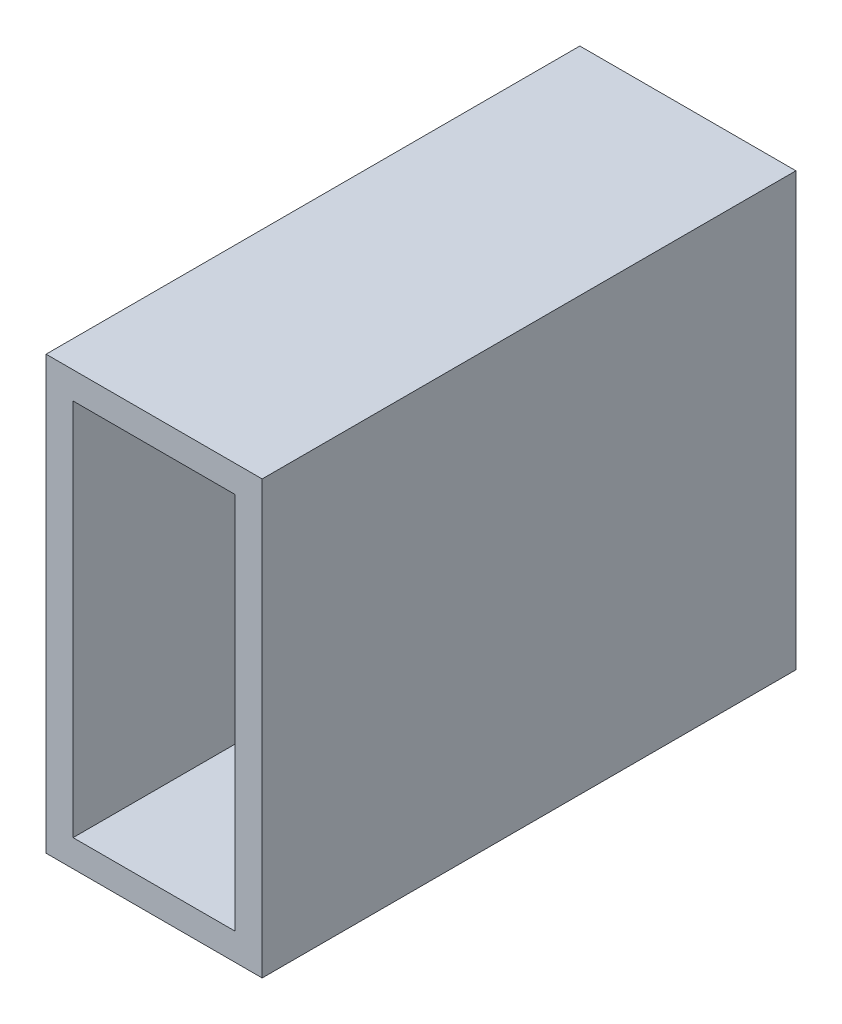
ISO-10303-21;
HEADER;
FILE_DESCRIPTION(('STEP AP214'),'2;1');
FILE_NAME('part.step','',(''),(''),'','','');
FILE_SCHEMA(('AUTOMOTIVE_DESIGN { 1 0 10303 214 1 1 1 1 }'));
ENDSEC;
DATA;
#1=APPLICATION_CONTEXT('core data for automotive mechanical design processes');
#2=APPLICATION_PROTOCOL_DEFINITION('international standard','automotive_design',2000,#1);
#3=PRODUCT_CONTEXT('',#1,'mechanical');
#4=PRODUCT('Part','Part','',(#3));
#5=PRODUCT_RELATED_PRODUCT_CATEGORY('part','',(#4));
#6=PRODUCT_DEFINITION_FORMATION('','',#4);
#7=PRODUCT_DEFINITION_CONTEXT('part definition',#1,'design');
#8=PRODUCT_DEFINITION('design','',#6,#7);
#9=PRODUCT_DEFINITION_SHAPE('','',#8);
#10=(LENGTH_UNIT() NAMED_UNIT(*) SI_UNIT(.MILLI.,.METRE.));
#11=(NAMED_UNIT(*) PLANE_ANGLE_UNIT() SI_UNIT($,.RADIAN.));
#12=(NAMED_UNIT(*) SI_UNIT($,.STERADIAN.) SOLID_ANGLE_UNIT());
#13=UNCERTAINTY_MEASURE_WITH_UNIT(LENGTH_MEASURE(1.E-05),#10,'distance_accuracy_value','');
#14=(GEOMETRIC_REPRESENTATION_CONTEXT(3) GLOBAL_UNCERTAINTY_ASSIGNED_CONTEXT((#13)) GLOBAL_UNIT_ASSIGNED_CONTEXT((#10,
#11,#12)) REPRESENTATION_CONTEXT('',''));
#15=CARTESIAN_POINT('',(0.,0.,0.));
#16=DIRECTION('',(0.,0.,1.));
#17=DIRECTION('',(1.,0.,0.));
#18=AXIS2_PLACEMENT_3D('',#15,#16,#17);
#19=CARTESIAN_POINT('',(0.,0.,31.369));
#20=DIRECTION('',(0.,0.,-1.));
#21=DIRECTION('',(-1.,0.,0.));
#22=AXIS2_PLACEMENT_3D('',#19,#20,#21);
#23=PLANE('',#22);
#24=DIRECTION('',(0.,1.,0.));
#25=VECTOR('',#24,1.);
#26=CARTESIAN_POINT('',(12.7,-25.4,31.369));
#27=LINE('',#26,#25);
#28=CARTESIAN_POINT('',(12.7,-25.4,31.369));
#29=VERTEX_POINT('',#28);
#30=CARTESIAN_POINT('',(12.7,25.4,31.369));
#31=VERTEX_POINT('',#30);
#32=EDGE_CURVE('E153',#29,#31,#27,.T.);
#33=ORIENTED_EDGE('',*,*,#32,.T.);
#34=DIRECTION('',(-1.,0.,0.));
#35=VECTOR('',#34,1.);
#36=CARTESIAN_POINT('',(-12.7,25.4,31.369));
#37=LINE('',#36,#35);
#38=CARTESIAN_POINT('',(-12.7,25.4,31.369));
#39=VERTEX_POINT('',#38);
#40=EDGE_CURVE('E157',#31,#39,#37,.T.);
#41=ORIENTED_EDGE('',*,*,#40,.T.);
#42=DIRECTION('',(0.,-1.,0.));
#43=VECTOR('',#42,1.);
#44=CARTESIAN_POINT('',(-12.7,-25.4,31.369));
#45=LINE('',#44,#43);
#46=CARTESIAN_POINT('',(-12.7,-25.4,31.369));
#47=VERTEX_POINT('',#46);
#48=EDGE_CURVE('E161',#39,#47,#45,.T.);
#49=ORIENTED_EDGE('',*,*,#48,.T.);
#50=DIRECTION('',(1.,0.,0.));
#51=VECTOR('',#50,1.);
#52=CARTESIAN_POINT('',(-12.7,-25.4,31.369));
#53=LINE('',#52,#51);
#54=EDGE_CURVE('E164',#47,#29,#53,.T.);
#55=ORIENTED_EDGE('',*,*,#54,.T.);
#56=EDGE_LOOP('',(#33,#41,#49,#55));
#57=FACE_BOUND('',#56,.T.);
#58=DIRECTION('',(0.,1.,0.));
#59=VECTOR('',#58,1.);
#60=CARTESIAN_POINT('',(9.52500000000001,-22.225,31.369));
#61=LINE('',#60,#59);
#62=CARTESIAN_POINT('',(9.52500000000001,-22.225,31.369));
#63=VERTEX_POINT('',#62);
#64=CARTESIAN_POINT('',(9.52500000000001,22.225,31.369));
#65=VERTEX_POINT('',#64);
#66=EDGE_CURVE('E105',#63,#65,#61,.T.);
#67=ORIENTED_EDGE('',*,*,#66,.F.);
#68=DIRECTION('',(1.,0.,0.));
#69=VECTOR('',#68,1.);
#70=CARTESIAN_POINT('',(-9.525,-22.225,31.369));
#71=LINE('',#70,#69);
#72=CARTESIAN_POINT('',(-9.525,-22.225,31.369));
#73=VERTEX_POINT('',#72);
#74=EDGE_CURVE('E131',#73,#63,#71,.T.);
#75=ORIENTED_EDGE('',*,*,#74,.F.);
#76=DIRECTION('',(0.,-1.,0.));
#77=VECTOR('',#76,1.);
#78=CARTESIAN_POINT('',(-9.525,-22.225,31.369));
#79=LINE('',#78,#77);
#80=CARTESIAN_POINT('',(-9.52500000000001,22.225,31.369));
#81=VERTEX_POINT('',#80);
#82=EDGE_CURVE('E127',#81,#73,#79,.T.);
#83=ORIENTED_EDGE('',*,*,#82,.F.);
#84=DIRECTION('',(-1.,0.,0.));
#85=VECTOR('',#84,1.);
#86=CARTESIAN_POINT('',(-9.52500000000001,22.225,31.369));
#87=LINE('',#86,#85);
#88=EDGE_CURVE('E114',#65,#81,#87,.T.);
#89=ORIENTED_EDGE('',*,*,#88,.F.);
#90=EDGE_LOOP('',(#67,#75,#83,#89));
#91=FACE_BOUND('',#90,.T.);
#92=ADVANCED_FACE('F39',(#57,#91),#23,.F.);
#93=CARTESIAN_POINT('',(0.,0.,-31.369));
#94=DIRECTION('',(0.,0.,-1.));
#95=DIRECTION('',(-1.,0.,0.));
#96=AXIS2_PLACEMENT_3D('',#93,#94,#95);
#97=PLANE('',#96);
#98=DIRECTION('',(0.,1.,0.));
#99=VECTOR('',#98,1.);
#100=CARTESIAN_POINT('',(12.7,-25.4,-31.369));
#101=LINE('',#100,#99);
#102=CARTESIAN_POINT('',(12.7,-25.4,-31.369));
#103=VERTEX_POINT('',#102);
#104=CARTESIAN_POINT('',(12.7,25.4,-31.369));
#105=VERTEX_POINT('',#104);
#106=EDGE_CURVE('E123',#103,#105,#101,.T.);
#107=ORIENTED_EDGE('',*,*,#106,.F.);
#108=DIRECTION('',(1.,0.,0.));
#109=VECTOR('',#108,1.);
#110=CARTESIAN_POINT('',(-12.7,-25.4,-31.369));
#111=LINE('',#110,#109);
#112=CARTESIAN_POINT('',(-12.7,-25.4,-31.369));
#113=VERTEX_POINT('',#112);
#114=EDGE_CURVE('E158',#113,#103,#111,.T.);
#115=ORIENTED_EDGE('',*,*,#114,.F.);
#116=DIRECTION('',(0.,-1.,0.));
#117=VECTOR('',#116,1.);
#118=CARTESIAN_POINT('',(-12.7,-25.4,-31.369));
#119=LINE('',#118,#117);
#120=CARTESIAN_POINT('',(-12.7,25.4,-31.369));
#121=VERTEX_POINT('',#120);
#122=EDGE_CURVE('E174',#121,#113,#119,.T.);
#123=ORIENTED_EDGE('',*,*,#122,.F.);
#124=DIRECTION('',(-1.,0.,0.));
#125=VECTOR('',#124,1.);
#126=CARTESIAN_POINT('',(-12.7,25.4,-31.369));
#127=LINE('',#126,#125);
#128=EDGE_CURVE('E171',#105,#121,#127,.T.);
#129=ORIENTED_EDGE('',*,*,#128,.F.);
#130=EDGE_LOOP('',(#107,#115,#123,#129));
#131=FACE_BOUND('',#130,.T.);
#132=DIRECTION('',(1.,0.,0.));
#133=VECTOR('',#132,1.);
#134=CARTESIAN_POINT('',(-9.525,-22.225,-31.369));
#135=LINE('',#134,#133);
#136=CARTESIAN_POINT('',(-9.525,-22.225,-31.369));
#137=VERTEX_POINT('',#136);
#138=CARTESIAN_POINT('',(9.52500000000001,-22.225,-31.369));
#139=VERTEX_POINT('',#138);
#140=EDGE_CURVE('E115',#137,#139,#135,.T.);
#141=ORIENTED_EDGE('',*,*,#140,.T.);
#142=DIRECTION('',(0.,1.,0.));
#143=VECTOR('',#142,1.);
#144=CARTESIAN_POINT('',(9.52500000000001,-22.225,-31.369));
#145=LINE('',#144,#143);
#146=CARTESIAN_POINT('',(9.52500000000001,22.225,-31.369));
#147=VERTEX_POINT('',#146);
#148=EDGE_CURVE('E63',#139,#147,#145,.T.);
#149=ORIENTED_EDGE('',*,*,#148,.T.);
#150=DIRECTION('',(-1.,0.,0.));
#151=VECTOR('',#150,1.);
#152=CARTESIAN_POINT('',(-9.52500000000001,22.225,-31.369));
#153=LINE('',#152,#151);
#154=CARTESIAN_POINT('',(-9.52500000000001,22.225,-31.369));
#155=VERTEX_POINT('',#154);
#156=EDGE_CURVE('E121',#147,#155,#153,.T.);
#157=ORIENTED_EDGE('',*,*,#156,.T.);
#158=DIRECTION('',(0.,-1.,0.));
#159=VECTOR('',#158,1.);
#160=CARTESIAN_POINT('',(-9.525,-22.225,-31.369));
#161=LINE('',#160,#159);
#162=EDGE_CURVE('E140',#155,#137,#161,.T.);
#163=ORIENTED_EDGE('',*,*,#162,.T.);
#164=EDGE_LOOP('',(#141,#149,#157,#163));
#165=FACE_BOUND('',#164,.T.);
#166=ADVANCED_FACE('F197',(#131,#165),#97,.T.);
#167=CARTESIAN_POINT('',(12.7,-25.4,31.369));
#168=DIRECTION('',(-1.,0.,0.));
#169=DIRECTION('',(0.,0.,1.));
#170=AXIS2_PLACEMENT_3D('',#167,#168,#169);
#171=PLANE('',#170);
#172=ORIENTED_EDGE('',*,*,#106,.T.);
#173=DIRECTION('',(0.,0.,-1.));
#174=VECTOR('',#173,1.);
#175=CARTESIAN_POINT('',(12.7,25.4,31.369));
#176=LINE('',#175,#174);
#177=EDGE_CURVE('E11',#31,#105,#176,.T.);
#178=ORIENTED_EDGE('',*,*,#177,.F.);
#179=ORIENTED_EDGE('',*,*,#32,.F.);
#180=DIRECTION('',(0.,0.,-1.));
#181=VECTOR('',#180,1.);
#182=CARTESIAN_POINT('',(12.7,-25.4,31.369));
#183=LINE('',#182,#181);
#184=EDGE_CURVE('E167',#29,#103,#183,.T.);
#185=ORIENTED_EDGE('',*,*,#184,.T.);
#186=EDGE_LOOP('',(#172,#178,#179,#185));
#187=FACE_BOUND('',#186,.T.);
#188=ADVANCED_FACE('F41',(#187),#171,.F.);
#189=CARTESIAN_POINT('',(-12.7,25.4,31.369));
#190=DIRECTION('',(0.,-1.,0.));
#191=DIRECTION('',(0.,0.,-1.));
#192=AXIS2_PLACEMENT_3D('',#189,#190,#191);
#193=PLANE('',#192);
#194=ORIENTED_EDGE('',*,*,#128,.T.);
#195=DIRECTION('',(0.,0.,-1.));
#196=VECTOR('',#195,1.);
#197=CARTESIAN_POINT('',(-12.7,25.4,31.369));
#198=LINE('',#197,#196);
#199=EDGE_CURVE('E48',#39,#121,#198,.T.);
#200=ORIENTED_EDGE('',*,*,#199,.F.);
#201=ORIENTED_EDGE('',*,*,#40,.F.);
#202=ORIENTED_EDGE('',*,*,#177,.T.);
#203=EDGE_LOOP('',(#194,#200,#201,#202));
#204=FACE_BOUND('',#203,.T.);
#205=ADVANCED_FACE('F207',(#204),#193,.F.);
#206=CARTESIAN_POINT('',(-12.7,-25.4,31.369));
#207=DIRECTION('',(1.,0.,0.));
#208=DIRECTION('',(0.,0.,-1.));
#209=AXIS2_PLACEMENT_3D('',#206,#207,#208);
#210=PLANE('',#209);
#211=ORIENTED_EDGE('',*,*,#122,.T.);
#212=DIRECTION('',(0.,0.,-1.));
#213=VECTOR('',#212,1.);
#214=CARTESIAN_POINT('',(-12.7,-25.4,31.369));
#215=LINE('',#214,#213);
#216=EDGE_CURVE('E182',#47,#113,#215,.T.);
#217=ORIENTED_EDGE('',*,*,#216,.F.);
#218=ORIENTED_EDGE('',*,*,#48,.F.);
#219=ORIENTED_EDGE('',*,*,#199,.T.);
#220=EDGE_LOOP('',(#211,#217,#218,#219));
#221=FACE_BOUND('',#220,.T.);
#222=ADVANCED_FACE('F191',(#221),#210,.F.);
#223=CARTESIAN_POINT('',(-12.7,-25.4,31.369));
#224=DIRECTION('',(0.,1.,0.));
#225=DIRECTION('',(0.,0.,1.));
#226=AXIS2_PLACEMENT_3D('',#223,#224,#225);
#227=PLANE('',#226);
#228=ORIENTED_EDGE('',*,*,#114,.T.);
#229=ORIENTED_EDGE('',*,*,#184,.F.);
#230=ORIENTED_EDGE('',*,*,#54,.F.);
#231=ORIENTED_EDGE('',*,*,#216,.T.);
#232=EDGE_LOOP('',(#228,#229,#230,#231));
#233=FACE_BOUND('',#232,.T.);
#234=ADVANCED_FACE('F201',(#233),#227,.F.);
#235=CARTESIAN_POINT('',(9.52500000000001,-22.225,31.369));
#236=DIRECTION('',(-1.,0.,0.));
#237=DIRECTION('',(0.,0.,1.));
#238=AXIS2_PLACEMENT_3D('',#235,#236,#237);
#239=PLANE('',#238);
#240=ORIENTED_EDGE('',*,*,#148,.F.);
#241=DIRECTION('',(0.,0.,-1.));
#242=VECTOR('',#241,1.);
#243=CARTESIAN_POINT('',(9.52500000000001,-22.225,31.369));
#244=LINE('',#243,#242);
#245=EDGE_CURVE('E109',#63,#139,#244,.T.);
#246=ORIENTED_EDGE('',*,*,#245,.F.);
#247=ORIENTED_EDGE('',*,*,#66,.T.);
#248=DIRECTION('',(0.,0.,-1.));
#249=VECTOR('',#248,1.);
#250=CARTESIAN_POINT('',(9.52500000000001,22.225,31.369));
#251=LINE('',#250,#249);
#252=EDGE_CURVE('E108',#65,#147,#251,.T.);
#253=ORIENTED_EDGE('',*,*,#252,.T.);
#254=EDGE_LOOP('',(#240,#246,#247,#253));
#255=FACE_BOUND('',#254,.T.);
#256=ADVANCED_FACE('F107',(#255),#239,.T.);
#257=CARTESIAN_POINT('',(-9.52500000000001,22.225,31.369));
#258=DIRECTION('',(0.,-1.,0.));
#259=DIRECTION('',(1.,0.,0.));
#260=AXIS2_PLACEMENT_3D('',#257,#258,#259);
#261=PLANE('',#260);
#262=ORIENTED_EDGE('',*,*,#156,.F.);
#263=ORIENTED_EDGE('',*,*,#252,.F.);
#264=ORIENTED_EDGE('',*,*,#88,.T.);
#265=DIRECTION('',(0.,0.,-1.));
#266=VECTOR('',#265,1.);
#267=CARTESIAN_POINT('',(-9.52500000000001,22.225,31.369));
#268=LINE('',#267,#266);
#269=EDGE_CURVE('E124',#81,#155,#268,.T.);
#270=ORIENTED_EDGE('',*,*,#269,.T.);
#271=EDGE_LOOP('',(#262,#263,#264,#270));
#272=FACE_BOUND('',#271,.T.);
#273=ADVANCED_FACE('F118',(#272),#261,.T.);
#274=CARTESIAN_POINT('',(-9.525,-22.225,31.369));
#275=DIRECTION('',(1.,0.,0.));
#276=DIRECTION('',(0.,1.,0.));
#277=AXIS2_PLACEMENT_3D('',#274,#275,#276);
#278=PLANE('',#277);
#279=ORIENTED_EDGE('',*,*,#162,.F.);
#280=ORIENTED_EDGE('',*,*,#269,.F.);
#281=ORIENTED_EDGE('',*,*,#82,.T.);
#282=DIRECTION('',(0.,0.,-1.));
#283=VECTOR('',#282,1.);
#284=CARTESIAN_POINT('',(-9.525,-22.225,31.369));
#285=LINE('',#284,#283);
#286=EDGE_CURVE('E55',#73,#137,#285,.T.);
#287=ORIENTED_EDGE('',*,*,#286,.T.);
#288=EDGE_LOOP('',(#279,#280,#281,#287));
#289=FACE_BOUND('',#288,.T.);
#290=ADVANCED_FACE('F230',(#289),#278,.T.);
#291=CARTESIAN_POINT('',(-9.525,-22.225,31.369));
#292=DIRECTION('',(0.,1.,0.));
#293=DIRECTION('',(-1.,0.,0.));
#294=AXIS2_PLACEMENT_3D('',#291,#292,#293);
#295=PLANE('',#294);
#296=ORIENTED_EDGE('',*,*,#140,.F.);
#297=ORIENTED_EDGE('',*,*,#286,.F.);
#298=ORIENTED_EDGE('',*,*,#74,.T.);
#299=ORIENTED_EDGE('',*,*,#245,.T.);
#300=EDGE_LOOP('',(#296,#297,#298,#299));
#301=FACE_BOUND('',#300,.T.);
#302=ADVANCED_FACE('F234',(#301),#295,.T.);
#303=CLOSED_SHELL('',(#92,#166,#188,#205,#222,#234,#256,#273,#290,#302));
#304=MANIFOLD_SOLID_BREP('B2',#303);
#305=ADVANCED_BREP_SHAPE_REPRESENTATION('',(#18,#304),#14);
#306=SHAPE_DEFINITION_REPRESENTATION(#9,#305);
ENDSEC;
END-ISO-10303-21;
